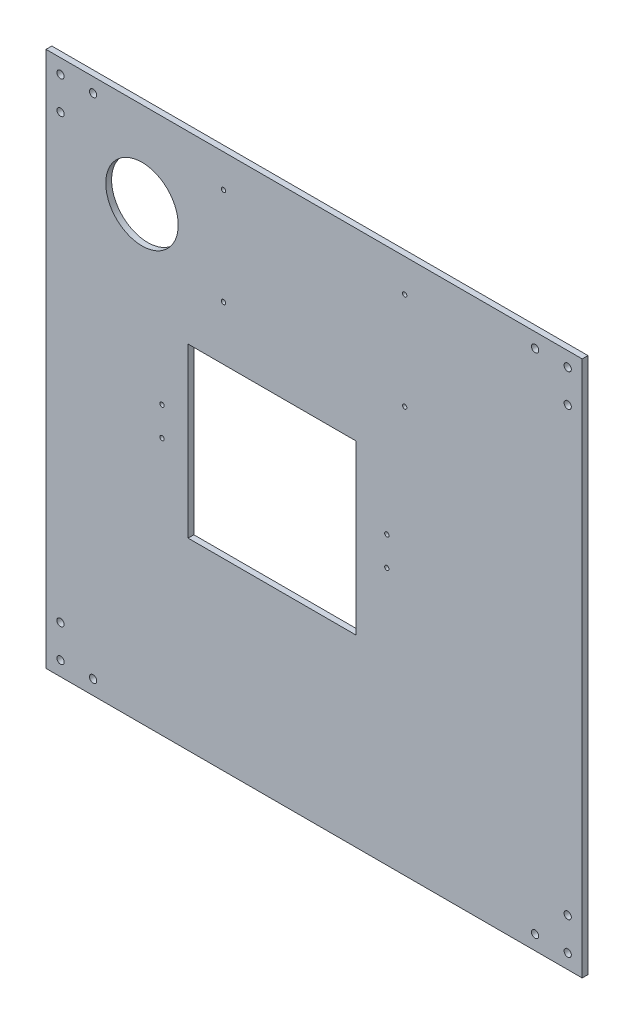
ISO-10303-21;
HEADER;
FILE_DESCRIPTION(('STEP AP214'),'2;1');
FILE_NAME('part.step','',(''),(''),'','','');
FILE_SCHEMA(('AUTOMOTIVE_DESIGN { 1 0 10303 214 1 1 1 1 }'));
ENDSEC;
DATA;
#1=APPLICATION_CONTEXT('core data for automotive mechanical design processes');
#2=APPLICATION_PROTOCOL_DEFINITION('international standard','automotive_design',2000,#1);
#3=PRODUCT_CONTEXT('',#1,'mechanical');
#4=PRODUCT('Part','Part','',(#3));
#5=PRODUCT_RELATED_PRODUCT_CATEGORY('part','',(#4));
#6=PRODUCT_DEFINITION_FORMATION('','',#4);
#7=PRODUCT_DEFINITION_CONTEXT('part definition',#1,'design');
#8=PRODUCT_DEFINITION('design','',#6,#7);
#9=PRODUCT_DEFINITION_SHAPE('','',#8);
#10=(LENGTH_UNIT() NAMED_UNIT(*) SI_UNIT(.MILLI.,.METRE.));
#11=(NAMED_UNIT(*) PLANE_ANGLE_UNIT() SI_UNIT($,.RADIAN.));
#12=(NAMED_UNIT(*) SI_UNIT($,.STERADIAN.) SOLID_ANGLE_UNIT());
#13=UNCERTAINTY_MEASURE_WITH_UNIT(LENGTH_MEASURE(1.E-05),#10,'distance_accuracy_value','');
#14=(GEOMETRIC_REPRESENTATION_CONTEXT(3) GLOBAL_UNCERTAINTY_ASSIGNED_CONTEXT((#13)) GLOBAL_UNIT_ASSIGNED_CONTEXT((#10,
#11,#12)) REPRESENTATION_CONTEXT('',''));
#15=CARTESIAN_POINT('',(0.,0.,0.));
#16=DIRECTION('',(0.,0.,1.));
#17=DIRECTION('',(1.,0.,0.));
#18=AXIS2_PLACEMENT_3D('',#15,#16,#17);
#19=CARTESIAN_POINT('',(-185.,-185.,4.));
#20=DIRECTION('',(1.,0.,0.));
#21=DIRECTION('',(0.,0.,-1.));
#22=AXIS2_PLACEMENT_3D('',#19,#20,#21);
#23=PLANE('',#22);
#24=DIRECTION('',(0.,-1.,0.));
#25=VECTOR('',#24,1.);
#26=CARTESIAN_POINT('',(-185.,-185.,0.));
#27=LINE('',#26,#25);
#28=CARTESIAN_POINT('',(-185.,185.,0.));
#29=VERTEX_POINT('',#28);
#30=CARTESIAN_POINT('',(-185.,-185.,0.));
#31=VERTEX_POINT('',#30);
#32=EDGE_CURVE('E252',#29,#31,#27,.T.);
#33=ORIENTED_EDGE('',*,*,#32,.T.);
#34=DIRECTION('',(0.,0.,-1.));
#35=VECTOR('',#34,1.);
#36=CARTESIAN_POINT('',(-185.,-185.,4.));
#37=LINE('',#36,#35);
#38=CARTESIAN_POINT('',(-185.,-185.,4.));
#39=VERTEX_POINT('',#38);
#40=EDGE_CURVE('E11',#39,#31,#37,.T.);
#41=ORIENTED_EDGE('',*,*,#40,.F.);
#42=DIRECTION('',(0.,-1.,0.));
#43=VECTOR('',#42,1.);
#44=CARTESIAN_POINT('',(-185.,-185.,4.));
#45=LINE('',#44,#43);
#46=CARTESIAN_POINT('',(-185.,185.,4.));
#47=VERTEX_POINT('',#46);
#48=EDGE_CURVE('E256',#47,#39,#45,.T.);
#49=ORIENTED_EDGE('',*,*,#48,.F.);
#50=DIRECTION('',(0.,0.,-1.));
#51=VECTOR('',#50,1.);
#52=CARTESIAN_POINT('',(-185.,185.,4.));
#53=LINE('',#52,#51);
#54=EDGE_CURVE('E270',#47,#29,#53,.T.);
#55=ORIENTED_EDGE('',*,*,#54,.T.);
#56=EDGE_LOOP('',(#33,#41,#49,#55));
#57=FACE_BOUND('',#56,.T.);
#58=ADVANCED_FACE('F42',(#57),#23,.F.);
#59=CARTESIAN_POINT('',(185.,-185.,4.));
#60=DIRECTION('',(0.,1.,0.));
#61=DIRECTION('',(-1.,0.,0.));
#62=AXIS2_PLACEMENT_3D('',#59,#60,#61);
#63=PLANE('',#62);
#64=DIRECTION('',(1.,0.,0.));
#65=VECTOR('',#64,1.);
#66=CARTESIAN_POINT('',(185.,-185.,0.));
#67=LINE('',#66,#65);
#68=CARTESIAN_POINT('',(185.,-185.,0.));
#69=VERTEX_POINT('',#68);
#70=EDGE_CURVE('E274',#31,#69,#67,.T.);
#71=ORIENTED_EDGE('',*,*,#70,.T.);
#72=DIRECTION('',(0.,0.,-1.));
#73=VECTOR('',#72,1.);
#74=CARTESIAN_POINT('',(185.,-185.,4.));
#75=LINE('',#74,#73);
#76=CARTESIAN_POINT('',(185.,-185.,4.));
#77=VERTEX_POINT('',#76);
#78=EDGE_CURVE('E50',#77,#69,#75,.T.);
#79=ORIENTED_EDGE('',*,*,#78,.F.);
#80=DIRECTION('',(1.,0.,0.));
#81=VECTOR('',#80,1.);
#82=CARTESIAN_POINT('',(185.,-185.,4.));
#83=LINE('',#82,#81);
#84=EDGE_CURVE('E260',#39,#77,#83,.T.);
#85=ORIENTED_EDGE('',*,*,#84,.F.);
#86=ORIENTED_EDGE('',*,*,#40,.T.);
#87=EDGE_LOOP('',(#71,#79,#85,#86));
#88=FACE_BOUND('',#87,.T.);
#89=ADVANCED_FACE('F309',(#88),#63,.F.);
#90=CARTESIAN_POINT('',(185.,-185.,4.));
#91=DIRECTION('',(-1.,0.,0.));
#92=DIRECTION('',(0.,0.,1.));
#93=AXIS2_PLACEMENT_3D('',#90,#91,#92);
#94=PLANE('',#93);
#95=DIRECTION('',(0.,1.,0.));
#96=VECTOR('',#95,1.);
#97=CARTESIAN_POINT('',(185.,-185.,0.));
#98=LINE('',#97,#96);
#99=CARTESIAN_POINT('',(185.,185.,0.));
#100=VERTEX_POINT('',#99);
#101=EDGE_CURVE('E277',#69,#100,#98,.T.);
#102=ORIENTED_EDGE('',*,*,#101,.T.);
#103=DIRECTION('',(0.,0.,-1.));
#104=VECTOR('',#103,1.);
#105=CARTESIAN_POINT('',(185.,185.,4.));
#106=LINE('',#105,#104);
#107=CARTESIAN_POINT('',(185.,185.,4.));
#108=VERTEX_POINT('',#107);
#109=EDGE_CURVE('E285',#108,#100,#106,.T.);
#110=ORIENTED_EDGE('',*,*,#109,.F.);
#111=DIRECTION('',(0.,1.,0.));
#112=VECTOR('',#111,1.);
#113=CARTESIAN_POINT('',(185.,-185.,4.));
#114=LINE('',#113,#112);
#115=EDGE_CURVE('E264',#77,#108,#114,.T.);
#116=ORIENTED_EDGE('',*,*,#115,.F.);
#117=ORIENTED_EDGE('',*,*,#78,.T.);
#118=EDGE_LOOP('',(#102,#110,#116,#117));
#119=FACE_BOUND('',#118,.T.);
#120=ADVANCED_FACE('F294',(#119),#94,.F.);
#121=CARTESIAN_POINT('',(185.,185.,4.));
#122=DIRECTION('',(0.,-1.,0.));
#123=DIRECTION('',(1.,0.,0.));
#124=AXIS2_PLACEMENT_3D('',#121,#122,#123);
#125=PLANE('',#124);
#126=DIRECTION('',(-1.,0.,0.));
#127=VECTOR('',#126,1.);
#128=CARTESIAN_POINT('',(185.,185.,0.));
#129=LINE('',#128,#127);
#130=EDGE_CURVE('E261',#100,#29,#129,.T.);
#131=ORIENTED_EDGE('',*,*,#130,.T.);
#132=ORIENTED_EDGE('',*,*,#54,.F.);
#133=DIRECTION('',(-1.,0.,0.));
#134=VECTOR('',#133,1.);
#135=CARTESIAN_POINT('',(185.,185.,4.));
#136=LINE('',#135,#134);
#137=EDGE_CURVE('E267',#108,#47,#136,.T.);
#138=ORIENTED_EDGE('',*,*,#137,.F.);
#139=ORIENTED_EDGE('',*,*,#109,.T.);
#140=EDGE_LOOP('',(#131,#132,#138,#139));
#141=FACE_BOUND('',#140,.T.);
#142=ADVANCED_FACE('F303',(#141),#125,.F.);
#143=CARTESIAN_POINT('',(0.,0.,4.));
#144=DIRECTION('',(0.,0.,1.));
#145=DIRECTION('',(1.,0.,0.));
#146=AXIS2_PLACEMENT_3D('',#143,#144,#145);
#147=PLANE('',#146);
#148=CARTESIAN_POINT('',(50.2133571496809,12.6940309715149,4.));
#149=DIRECTION('',(0.,0.,1.));
#150=DIRECTION('',(1.,0.,0.));
#151=AXIS2_PLACEMENT_3D('',#148,#149,#150);
#152=CIRCLE('',#151,1.5);
#153=CARTESIAN_POINT('',(51.7133571496809,12.6940309715149,4.));
#154=VERTEX_POINT('',#153);
#155=EDGE_CURVE('E454',#154,#154,#152,.T.);
#156=ORIENTED_EDGE('',*,*,#155,.F.);
#157=EDGE_LOOP('',(#156));
#158=FACE_BOUND('',#157,.T.);
#159=CARTESIAN_POINT('',(-104.956152895011,-7.30871880372212,4.));
#160=DIRECTION('',(0.,0.,1.));
#161=DIRECTION('',(1.,0.,0.));
#162=AXIS2_PLACEMENT_3D('',#159,#160,#161);
#163=CIRCLE('',#162,1.5);
#164=CARTESIAN_POINT('',(-103.456152895011,-7.30871880372212,4.));
#165=VERTEX_POINT('',#164);
#166=EDGE_CURVE('E450',#165,#165,#163,.T.);
#167=ORIENTED_EDGE('',*,*,#166,.F.);
#168=EDGE_LOOP('',(#167));
#169=FACE_BOUND('',#168,.T.);
#170=CARTESIAN_POINT('',(-104.956152895011,12.6912811962779,4.));
#171=DIRECTION('',(0.,0.,1.));
#172=DIRECTION('',(1.,0.,0.));
#173=AXIS2_PLACEMENT_3D('',#170,#171,#172);
#174=CIRCLE('',#173,1.50000000000001);
#175=CARTESIAN_POINT('',(-103.456152895011,12.6912811962779,4.));
#176=VERTEX_POINT('',#175);
#177=EDGE_CURVE('E424',#176,#176,#174,.T.);
#178=ORIENTED_EDGE('',*,*,#177,.F.);
#179=EDGE_LOOP('',(#178));
#180=FACE_BOUND('',#179,.T.);
#181=CARTESIAN_POINT('',(50.2133571496808,-7.30596902848515,4.));
#182=DIRECTION('',(0.,0.,1.));
#183=DIRECTION('',(1.,0.,0.));
#184=AXIS2_PLACEMENT_3D('',#181,#182,#183);
#185=CIRCLE('',#184,1.5);
#186=CARTESIAN_POINT('',(51.7133571496808,-7.30596902848515,4.));
#187=VERTEX_POINT('',#186);
#188=EDGE_CURVE('E444',#187,#187,#185,.T.);
#189=ORIENTED_EDGE('',*,*,#188,.F.);
#190=EDGE_LOOP('',(#189));
#191=FACE_BOUND('',#190,.T.);
#192=CARTESIAN_POINT('',(-118.76985494899,125.631801741306,4.));
#193=DIRECTION('',(0.,0.,-1.));
#194=DIRECTION('',(-1.,0.,0.));
#195=AXIS2_PLACEMENT_3D('',#192,#193,#194);
#196=CIRCLE('',#195,25.);
#197=CARTESIAN_POINT('',(-143.76985494899,125.631801741306,4.));
#198=VERTEX_POINT('',#197);
#199=EDGE_CURVE('E459',#198,#198,#196,.T.);
#200=ORIENTED_EDGE('',*,*,#199,.T.);
#201=EDGE_LOOP('',(#200));
#202=FACE_BOUND('',#201,.T.);
#203=CARTESIAN_POINT('',(-62.5,95.2497952517391,4.));
#204=DIRECTION('',(0.,0.,-1.));
#205=DIRECTION('',(-1.,0.,0.));
#206=AXIS2_PLACEMENT_3D('',#203,#204,#205);
#207=CIRCLE('',#206,1.5);
#208=CARTESIAN_POINT('',(-64.,95.2497952517391,4.));
#209=VERTEX_POINT('',#208);
#210=EDGE_CURVE('E479',#209,#209,#207,.T.);
#211=ORIENTED_EDGE('',*,*,#210,.T.);
#212=EDGE_LOOP('',(#211));
#213=FACE_BOUND('',#212,.T.);
#214=CARTESIAN_POINT('',(62.5,162.249795251739,4.));
#215=DIRECTION('',(0.,0.,-1.));
#216=DIRECTION('',(-1.,0.,0.));
#217=AXIS2_PLACEMENT_3D('',#214,#215,#216);
#218=CIRCLE('',#217,1.5);
#219=CARTESIAN_POINT('',(61.,162.249795251739,4.));
#220=VERTEX_POINT('',#219);
#221=EDGE_CURVE('E471',#220,#220,#218,.T.);
#222=ORIENTED_EDGE('',*,*,#221,.T.);
#223=EDGE_LOOP('',(#222));
#224=FACE_BOUND('',#223,.T.);
#225=CARTESIAN_POINT('',(-62.5,162.249795251739,4.));
#226=DIRECTION('',(0.,0.,-1.));
#227=DIRECTION('',(-1.,0.,0.));
#228=AXIS2_PLACEMENT_3D('',#225,#226,#227);
#229=CIRCLE('',#228,1.5);
#230=CARTESIAN_POINT('',(-64.,162.249795251739,4.));
#231=VERTEX_POINT('',#230);
#232=EDGE_CURVE('E463',#231,#231,#229,.T.);
#233=ORIENTED_EDGE('',*,*,#232,.T.);
#234=EDGE_LOOP('',(#233));
#235=FACE_BOUND('',#234,.T.);
#236=CARTESIAN_POINT('',(62.5,95.2497952517391,4.));
#237=DIRECTION('',(0.,0.,-1.));
#238=DIRECTION('',(-1.,0.,0.));
#239=AXIS2_PLACEMENT_3D('',#236,#237,#238);
#240=CIRCLE('',#239,1.5);
#241=CARTESIAN_POINT('',(61.,95.2497952517391,4.));
#242=VERTEX_POINT('',#241);
#243=EDGE_CURVE('E145',#242,#242,#240,.T.);
#244=ORIENTED_EDGE('',*,*,#243,.T.);
#245=EDGE_LOOP('',(#244));
#246=FACE_BOUND('',#245,.T.);
#247=DIRECTION('',(0.,-1.,0.));
#248=VECTOR('',#247,1.);
#249=CARTESIAN_POINT('',(29.0438471049889,57.9100000000002,4.));
#250=LINE('',#249,#248);
#251=CARTESIAN_POINT('',(29.0438471049889,57.9100000000002,4.));
#252=VERTEX_POINT('',#251);
#253=CARTESIAN_POINT('',(29.0438471049887,-58.0899999999998,4.));
#254=VERTEX_POINT('',#253);
#255=EDGE_CURVE('E109',#252,#254,#250,.T.);
#256=ORIENTED_EDGE('',*,*,#255,.T.);
#257=DIRECTION('',(-1.,0.,0.));
#258=VECTOR('',#257,1.);
#259=CARTESIAN_POINT('',(29.0438471049887,-58.0899999999998,4.));
#260=LINE('',#259,#258);
#261=CARTESIAN_POINT('',(-86.9561528950114,-58.0899999999996,4.));
#262=VERTEX_POINT('',#261);
#263=EDGE_CURVE('E119',#254,#262,#260,.T.);
#264=ORIENTED_EDGE('',*,*,#263,.T.);
#265=DIRECTION('',(0.,1.,0.));
#266=VECTOR('',#265,1.);
#267=CARTESIAN_POINT('',(-86.9561528950114,-58.0899999999996,4.));
#268=LINE('',#267,#266);
#269=CARTESIAN_POINT('',(-86.9561528950111,57.9100000000004,4.));
#270=VERTEX_POINT('',#269);
#271=EDGE_CURVE('E57',#262,#270,#268,.T.);
#272=ORIENTED_EDGE('',*,*,#271,.T.);
#273=DIRECTION('',(1.,0.,0.));
#274=VECTOR('',#273,1.);
#275=CARTESIAN_POINT('',(-86.9561528950111,57.9100000000004,4.));
#276=LINE('',#275,#274);
#277=EDGE_CURVE('E116',#270,#252,#276,.T.);
#278=ORIENTED_EDGE('',*,*,#277,.T.);
#279=EDGE_LOOP('',(#256,#264,#272,#278));
#280=FACE_BOUND('',#279,.T.);
#281=CARTESIAN_POINT('',(-152.499999999999,175.000000000001,4.));
#282=DIRECTION('',(0.,0.,1.));
#283=DIRECTION('',(1.,0.,0.));
#284=AXIS2_PLACEMENT_3D('',#281,#282,#283);
#285=CIRCLE('',#284,2.5);
#286=CARTESIAN_POINT('',(-149.999999999999,175.000000000001,4.));
#287=VERTEX_POINT('',#286);
#288=EDGE_CURVE('E200',#287,#287,#285,.T.);
#289=ORIENTED_EDGE('',*,*,#288,.F.);
#290=EDGE_LOOP('',(#289));
#291=FACE_BOUND('',#290,.T.);
#292=CARTESIAN_POINT('',(175.000000000001,174.999999999999,4.));
#293=DIRECTION('',(0.,0.,1.));
#294=DIRECTION('',(1.,0.,0.));
#295=AXIS2_PLACEMENT_3D('',#292,#293,#294);
#296=CIRCLE('',#295,2.49999999999999);
#297=CARTESIAN_POINT('',(177.500000000001,174.999999999999,4.));
#298=VERTEX_POINT('',#297);
#299=EDGE_CURVE('E209',#298,#298,#296,.T.);
#300=ORIENTED_EDGE('',*,*,#299,.F.);
#301=EDGE_LOOP('',(#300));
#302=FACE_BOUND('',#301,.T.);
#303=CARTESIAN_POINT('',(152.500000000001,174.999999999999,4.));
#304=DIRECTION('',(0.,0.,1.));
#305=DIRECTION('',(1.,0.,0.));
#306=AXIS2_PLACEMENT_3D('',#303,#304,#305);
#307=CIRCLE('',#306,2.5);
#308=CARTESIAN_POINT('',(155.000000000001,174.999999999999,4.));
#309=VERTEX_POINT('',#308);
#310=EDGE_CURVE('E184',#309,#309,#307,.T.);
#311=ORIENTED_EDGE('',*,*,#310,.F.);
#312=EDGE_LOOP('',(#311));
#313=FACE_BOUND('',#312,.T.);
#314=CARTESIAN_POINT('',(175.000000000001,152.499999999999,4.));
#315=DIRECTION('',(0.,0.,1.));
#316=DIRECTION('',(1.,0.,0.));
#317=AXIS2_PLACEMENT_3D('',#314,#315,#316);
#318=CIRCLE('',#317,2.49999999999999);
#319=CARTESIAN_POINT('',(177.500000000001,152.499999999999,4.));
#320=VERTEX_POINT('',#319);
#321=EDGE_CURVE('E193',#320,#320,#318,.T.);
#322=ORIENTED_EDGE('',*,*,#321,.F.);
#323=EDGE_LOOP('',(#322));
#324=FACE_BOUND('',#323,.T.);
#325=CARTESIAN_POINT('',(-174.999999999999,152.500000000001,4.));
#326=DIRECTION('',(0.,0.,1.));
#327=DIRECTION('',(1.,0.,0.));
#328=AXIS2_PLACEMENT_3D('',#325,#326,#327);
#329=CIRCLE('',#328,2.5);
#330=CARTESIAN_POINT('',(-172.499999999999,152.500000000001,4.));
#331=VERTEX_POINT('',#330);
#332=EDGE_CURVE('E241',#331,#331,#329,.T.);
#333=ORIENTED_EDGE('',*,*,#332,.F.);
#334=EDGE_LOOP('',(#333));
#335=FACE_BOUND('',#334,.T.);
#336=CARTESIAN_POINT('',(-174.999999999999,175.000000000001,4.));
#337=DIRECTION('',(0.,0.,1.));
#338=DIRECTION('',(1.,0.,0.));
#339=AXIS2_PLACEMENT_3D('',#336,#337,#338);
#340=CIRCLE('',#339,2.5);
#341=CARTESIAN_POINT('',(-172.499999999999,175.000000000001,4.));
#342=VERTEX_POINT('',#341);
#343=EDGE_CURVE('E233',#342,#342,#340,.T.);
#344=ORIENTED_EDGE('',*,*,#343,.F.);
#345=EDGE_LOOP('',(#344));
#346=FACE_BOUND('',#345,.T.);
#347=CARTESIAN_POINT('',(-175.,-152.5,4.));
#348=DIRECTION('',(0.,0.,1.));
#349=DIRECTION('',(1.,0.,0.));
#350=AXIS2_PLACEMENT_3D('',#347,#348,#349);
#351=CIRCLE('',#350,2.5);
#352=CARTESIAN_POINT('',(-172.5,-152.5,4.));
#353=VERTEX_POINT('',#352);
#354=EDGE_CURVE('E225',#353,#353,#351,.T.);
#355=ORIENTED_EDGE('',*,*,#354,.F.);
#356=EDGE_LOOP('',(#355));
#357=FACE_BOUND('',#356,.T.);
#358=CARTESIAN_POINT('',(-152.5,-175.,4.));
#359=DIRECTION('',(0.,0.,1.));
#360=DIRECTION('',(1.,0.,0.));
#361=AXIS2_PLACEMENT_3D('',#358,#359,#360);
#362=CIRCLE('',#361,2.5);
#363=CARTESIAN_POINT('',(-150.,-175.,4.));
#364=VERTEX_POINT('',#363);
#365=EDGE_CURVE('E216',#364,#364,#362,.T.);
#366=ORIENTED_EDGE('',*,*,#365,.F.);
#367=EDGE_LOOP('',(#366));
#368=FACE_BOUND('',#367,.T.);
#369=CARTESIAN_POINT('',(174.999999999998,-175.000000000002,4.));
#370=DIRECTION('',(0.,0.,1.));
#371=DIRECTION('',(1.,0.,0.));
#372=AXIS2_PLACEMENT_3D('',#369,#370,#371);
#373=CIRCLE('',#372,2.49999999999999);
#374=CARTESIAN_POINT('',(177.499999999998,-175.000000000002,4.));
#375=VERTEX_POINT('',#374);
#376=EDGE_CURVE('E160',#375,#375,#373,.T.);
#377=ORIENTED_EDGE('',*,*,#376,.F.);
#378=EDGE_LOOP('',(#377));
#379=FACE_BOUND('',#378,.T.);
#380=CARTESIAN_POINT('',(174.999999999998,-152.500000000002,4.));
#381=DIRECTION('',(0.,0.,1.));
#382=DIRECTION('',(1.,0.,0.));
#383=AXIS2_PLACEMENT_3D('',#380,#381,#382);
#384=CIRCLE('',#383,2.49999999999999);
#385=CARTESIAN_POINT('',(177.499999999998,-152.500000000002,4.));
#386=VERTEX_POINT('',#385);
#387=EDGE_CURVE('E169',#386,#386,#384,.T.);
#388=ORIENTED_EDGE('',*,*,#387,.F.);
#389=EDGE_LOOP('',(#388));
#390=FACE_BOUND('',#389,.T.);
#391=CARTESIAN_POINT('',(152.499999999998,-175.000000000002,4.));
#392=DIRECTION('',(0.,0.,1.));
#393=DIRECTION('',(1.,0.,0.));
#394=AXIS2_PLACEMENT_3D('',#391,#392,#393);
#395=CIRCLE('',#394,2.50000000000001);
#396=CARTESIAN_POINT('',(154.999999999998,-175.000000000002,4.));
#397=VERTEX_POINT('',#396);
#398=EDGE_CURVE('E177',#397,#397,#395,.T.);
#399=ORIENTED_EDGE('',*,*,#398,.F.);
#400=EDGE_LOOP('',(#399));
#401=FACE_BOUND('',#400,.T.);
#402=CARTESIAN_POINT('',(-175.,-175.,4.));
#403=DIRECTION('',(0.,0.,1.));
#404=DIRECTION('',(1.,0.,0.));
#405=AXIS2_PLACEMENT_3D('',#402,#403,#404);
#406=CIRCLE('',#405,2.5);
#407=CARTESIAN_POINT('',(-172.5,-175.,4.));
#408=VERTEX_POINT('',#407);
#409=EDGE_CURVE('E220',#408,#408,#406,.T.);
#410=ORIENTED_EDGE('',*,*,#409,.F.);
#411=EDGE_LOOP('',(#410));
#412=FACE_BOUND('',#411,.T.);
#413=ORIENTED_EDGE('',*,*,#48,.T.);
#414=ORIENTED_EDGE('',*,*,#84,.T.);
#415=ORIENTED_EDGE('',*,*,#115,.T.);
#416=ORIENTED_EDGE('',*,*,#137,.T.);
#417=EDGE_LOOP('',(#413,#414,#415,#416));
#418=FACE_BOUND('',#417,.T.);
#419=ADVANCED_FACE('F124',(#158,#169,#180,#191,#202,#213,#224,#235,#246,#280,#291,#302,#313,
#324,#335,#346,#357,#368,#379,#390,#401,#412,#418),#147,.T.);
#420=CARTESIAN_POINT('',(0.,0.,0.));
#421=DIRECTION('',(0.,0.,1.));
#422=DIRECTION('',(1.,0.,0.));
#423=AXIS2_PLACEMENT_3D('',#420,#421,#422);
#424=PLANE('',#423);
#425=CARTESIAN_POINT('',(50.2133571496809,12.6940309715149,0.));
#426=DIRECTION('',(0.,0.,-1.));
#427=DIRECTION('',(-1.,0.,0.));
#428=AXIS2_PLACEMENT_3D('',#425,#426,#427);
#429=CIRCLE('',#428,1.5);
#430=CARTESIAN_POINT('',(48.7133571496809,12.6940309715149,0.));
#431=VERTEX_POINT('',#430);
#432=EDGE_CURVE('E434',#431,#431,#429,.T.);
#433=ORIENTED_EDGE('',*,*,#432,.F.);
#434=EDGE_LOOP('',(#433));
#435=FACE_BOUND('',#434,.T.);
#436=CARTESIAN_POINT('',(-104.956152895011,-7.30871880372212,0.));
#437=DIRECTION('',(0.,0.,-1.));
#438=DIRECTION('',(-1.,0.,0.));
#439=AXIS2_PLACEMENT_3D('',#436,#437,#438);
#440=CIRCLE('',#439,1.5);
#441=CARTESIAN_POINT('',(-106.456152895011,-7.30871880372212,0.));
#442=VERTEX_POINT('',#441);
#443=EDGE_CURVE('E430',#442,#442,#440,.T.);
#444=ORIENTED_EDGE('',*,*,#443,.F.);
#445=EDGE_LOOP('',(#444));
#446=FACE_BOUND('',#445,.T.);
#447=CARTESIAN_POINT('',(-104.956152895011,12.6912811962779,0.));
#448=DIRECTION('',(0.,0.,-1.));
#449=DIRECTION('',(-1.,0.,0.));
#450=AXIS2_PLACEMENT_3D('',#447,#448,#449);
#451=CIRCLE('',#450,1.50000000000001);
#452=CARTESIAN_POINT('',(-106.456152895011,12.6912811962779,0.));
#453=VERTEX_POINT('',#452);
#454=EDGE_CURVE('E427',#453,#453,#451,.T.);
#455=ORIENTED_EDGE('',*,*,#454,.F.);
#456=EDGE_LOOP('',(#455));
#457=FACE_BOUND('',#456,.T.);
#458=CARTESIAN_POINT('',(50.2133571496808,-7.30596902848515,0.));
#459=DIRECTION('',(0.,0.,-1.));
#460=DIRECTION('',(-1.,0.,0.));
#461=AXIS2_PLACEMENT_3D('',#458,#459,#460);
#462=CIRCLE('',#461,1.5);
#463=CARTESIAN_POINT('',(48.7133571496808,-7.30596902848515,0.));
#464=VERTEX_POINT('',#463);
#465=EDGE_CURVE('E439',#464,#464,#462,.T.);
#466=ORIENTED_EDGE('',*,*,#465,.F.);
#467=EDGE_LOOP('',(#466));
#468=FACE_BOUND('',#467,.T.);
#469=CARTESIAN_POINT('',(-118.76985494899,125.631801741306,0.));
#470=DIRECTION('',(0.,0.,-1.));
#471=DIRECTION('',(-1.,0.,0.));
#472=AXIS2_PLACEMENT_3D('',#469,#470,#471);
#473=CIRCLE('',#472,25.);
#474=CARTESIAN_POINT('',(-143.76985494899,125.631801741306,0.));
#475=VERTEX_POINT('',#474);
#476=EDGE_CURVE('E458',#475,#475,#473,.T.);
#477=ORIENTED_EDGE('',*,*,#476,.F.);
#478=EDGE_LOOP('',(#477));
#479=FACE_BOUND('',#478,.T.);
#480=CARTESIAN_POINT('',(-62.5,95.2497952517391,0.));
#481=DIRECTION('',(0.,0.,-1.));
#482=DIRECTION('',(-1.,0.,0.));
#483=AXIS2_PLACEMENT_3D('',#480,#481,#482);
#484=CIRCLE('',#483,1.5);
#485=CARTESIAN_POINT('',(-64.,95.2497952517391,0.));
#486=VERTEX_POINT('',#485);
#487=EDGE_CURVE('E475',#486,#486,#484,.T.);
#488=ORIENTED_EDGE('',*,*,#487,.F.);
#489=EDGE_LOOP('',(#488));
#490=FACE_BOUND('',#489,.T.);
#491=CARTESIAN_POINT('',(62.5,162.249795251739,0.));
#492=DIRECTION('',(0.,0.,-1.));
#493=DIRECTION('',(-1.,0.,0.));
#494=AXIS2_PLACEMENT_3D('',#491,#492,#493);
#495=CIRCLE('',#494,1.5);
#496=CARTESIAN_POINT('',(61.,162.249795251739,0.));
#497=VERTEX_POINT('',#496);
#498=EDGE_CURVE('E483',#497,#497,#495,.T.);
#499=ORIENTED_EDGE('',*,*,#498,.F.);
#500=EDGE_LOOP('',(#499));
#501=FACE_BOUND('',#500,.T.);
#502=CARTESIAN_POINT('',(-62.5,162.249795251739,0.));
#503=DIRECTION('',(0.,0.,-1.));
#504=DIRECTION('',(-1.,0.,0.));
#505=AXIS2_PLACEMENT_3D('',#502,#503,#504);
#506=CIRCLE('',#505,1.5);
#507=CARTESIAN_POINT('',(-64.,162.249795251739,0.));
#508=VERTEX_POINT('',#507);
#509=EDGE_CURVE('E467',#508,#508,#506,.T.);
#510=ORIENTED_EDGE('',*,*,#509,.F.);
#511=EDGE_LOOP('',(#510));
#512=FACE_BOUND('',#511,.T.);
#513=CARTESIAN_POINT('',(62.5,95.2497952517391,0.));
#514=DIRECTION('',(0.,0.,-1.));
#515=DIRECTION('',(-1.,0.,0.));
#516=AXIS2_PLACEMENT_3D('',#513,#514,#515);
#517=CIRCLE('',#516,1.5);
#518=CARTESIAN_POINT('',(61.,95.2497952517391,0.));
#519=VERTEX_POINT('',#518);
#520=EDGE_CURVE('E135',#519,#519,#517,.T.);
#521=ORIENTED_EDGE('',*,*,#520,.F.);
#522=EDGE_LOOP('',(#521));
#523=FACE_BOUND('',#522,.T.);
#524=DIRECTION('',(-1.,0.,0.));
#525=VECTOR('',#524,1.);
#526=CARTESIAN_POINT('',(29.0438471049887,-58.0899999999998,0.));
#527=LINE('',#526,#525);
#528=CARTESIAN_POINT('',(29.0438471049887,-58.0899999999998,0.));
#529=VERTEX_POINT('',#528);
#530=CARTESIAN_POINT('',(-86.9561528950114,-58.0899999999996,0.));
#531=VERTEX_POINT('',#530);
#532=EDGE_CURVE('E144',#529,#531,#527,.T.);
#533=ORIENTED_EDGE('',*,*,#532,.F.);
#534=DIRECTION('',(0.,-1.,0.));
#535=VECTOR('',#534,1.);
#536=CARTESIAN_POINT('',(29.0438471049889,57.9100000000002,0.));
#537=LINE('',#536,#535);
#538=CARTESIAN_POINT('',(29.0438471049889,57.9100000000002,0.));
#539=VERTEX_POINT('',#538);
#540=EDGE_CURVE('E65',#539,#529,#537,.T.);
#541=ORIENTED_EDGE('',*,*,#540,.F.);
#542=DIRECTION('',(1.,0.,0.));
#543=VECTOR('',#542,1.);
#544=CARTESIAN_POINT('',(-86.9561528950111,57.9100000000004,0.));
#545=LINE('',#544,#543);
#546=CARTESIAN_POINT('',(-86.9561528950111,57.9100000000004,0.));
#547=VERTEX_POINT('',#546);
#548=EDGE_CURVE('E128',#547,#539,#545,.T.);
#549=ORIENTED_EDGE('',*,*,#548,.F.);
#550=DIRECTION('',(0.,1.,0.));
#551=VECTOR('',#550,1.);
#552=CARTESIAN_POINT('',(-86.9561528950114,-58.0899999999996,0.));
#553=LINE('',#552,#551);
#554=EDGE_CURVE('E132',#531,#547,#553,.T.);
#555=ORIENTED_EDGE('',*,*,#554,.F.);
#556=EDGE_LOOP('',(#533,#541,#549,#555));
#557=FACE_BOUND('',#556,.T.);
#558=CARTESIAN_POINT('',(-152.499999999999,175.000000000001,0.));
#559=DIRECTION('',(0.,0.,1.));
#560=DIRECTION('',(1.,0.,0.));
#561=AXIS2_PLACEMENT_3D('',#558,#559,#560);
#562=CIRCLE('',#561,2.5);
#563=CARTESIAN_POINT('',(-149.999999999999,175.000000000001,0.));
#564=VERTEX_POINT('',#563);
#565=EDGE_CURVE('E205',#564,#564,#562,.T.);
#566=ORIENTED_EDGE('',*,*,#565,.T.);
#567=EDGE_LOOP('',(#566));
#568=FACE_BOUND('',#567,.T.);
#569=CARTESIAN_POINT('',(175.000000000001,174.999999999999,0.));
#570=DIRECTION('',(0.,0.,1.));
#571=DIRECTION('',(1.,0.,0.));
#572=AXIS2_PLACEMENT_3D('',#569,#570,#571);
#573=CIRCLE('',#572,2.49999999999999);
#574=CARTESIAN_POINT('',(177.500000000001,174.999999999999,0.));
#575=VERTEX_POINT('',#574);
#576=EDGE_CURVE('E188',#575,#575,#573,.T.);
#577=ORIENTED_EDGE('',*,*,#576,.T.);
#578=EDGE_LOOP('',(#577));
#579=FACE_BOUND('',#578,.T.);
#580=CARTESIAN_POINT('',(152.500000000001,174.999999999999,0.));
#581=DIRECTION('',(0.,0.,1.));
#582=DIRECTION('',(1.,0.,0.));
#583=AXIS2_PLACEMENT_3D('',#580,#581,#582);
#584=CIRCLE('',#583,2.5);
#585=CARTESIAN_POINT('',(155.000000000001,174.999999999999,0.));
#586=VERTEX_POINT('',#585);
#587=EDGE_CURVE('E189',#586,#586,#584,.T.);
#588=ORIENTED_EDGE('',*,*,#587,.T.);
#589=EDGE_LOOP('',(#588));
#590=FACE_BOUND('',#589,.T.);
#591=CARTESIAN_POINT('',(175.000000000001,152.499999999999,0.));
#592=DIRECTION('',(0.,0.,1.));
#593=DIRECTION('',(1.,0.,0.));
#594=AXIS2_PLACEMENT_3D('',#591,#592,#593);
#595=CIRCLE('',#594,2.49999999999999);
#596=CARTESIAN_POINT('',(177.500000000001,152.499999999999,0.));
#597=VERTEX_POINT('',#596);
#598=EDGE_CURVE('E164',#597,#597,#595,.T.);
#599=ORIENTED_EDGE('',*,*,#598,.T.);
#600=EDGE_LOOP('',(#599));
#601=FACE_BOUND('',#600,.T.);
#602=CARTESIAN_POINT('',(-174.999999999999,152.500000000001,0.));
#603=DIRECTION('',(0.,0.,1.));
#604=DIRECTION('',(1.,0.,0.));
#605=AXIS2_PLACEMENT_3D('',#602,#603,#604);
#606=CIRCLE('',#605,2.5);
#607=CARTESIAN_POINT('',(-172.499999999999,152.500000000001,0.));
#608=VERTEX_POINT('',#607);
#609=EDGE_CURVE('E204',#608,#608,#606,.T.);
#610=ORIENTED_EDGE('',*,*,#609,.T.);
#611=EDGE_LOOP('',(#610));
#612=FACE_BOUND('',#611,.T.);
#613=CARTESIAN_POINT('',(-174.999999999999,175.000000000001,0.));
#614=DIRECTION('',(0.,0.,1.));
#615=DIRECTION('',(1.,0.,0.));
#616=AXIS2_PLACEMENT_3D('',#613,#614,#615);
#617=CIRCLE('',#616,2.5);
#618=CARTESIAN_POINT('',(-172.499999999999,175.000000000001,0.));
#619=VERTEX_POINT('',#618);
#620=EDGE_CURVE('E237',#619,#619,#617,.T.);
#621=ORIENTED_EDGE('',*,*,#620,.T.);
#622=EDGE_LOOP('',(#621));
#623=FACE_BOUND('',#622,.T.);
#624=CARTESIAN_POINT('',(-175.,-152.5,0.));
#625=DIRECTION('',(0.,0.,1.));
#626=DIRECTION('',(1.,0.,0.));
#627=AXIS2_PLACEMENT_3D('',#624,#625,#626);
#628=CIRCLE('',#627,2.5);
#629=CARTESIAN_POINT('',(-172.5,-152.5,0.));
#630=VERTEX_POINT('',#629);
#631=EDGE_CURVE('E229',#630,#630,#628,.T.);
#632=ORIENTED_EDGE('',*,*,#631,.T.);
#633=EDGE_LOOP('',(#632));
#634=FACE_BOUND('',#633,.T.);
#635=CARTESIAN_POINT('',(-152.5,-175.,0.));
#636=DIRECTION('',(0.,0.,1.));
#637=DIRECTION('',(1.,0.,0.));
#638=AXIS2_PLACEMENT_3D('',#635,#636,#637);
#639=CIRCLE('',#638,2.5);
#640=CARTESIAN_POINT('',(-150.,-175.,0.));
#641=VERTEX_POINT('',#640);
#642=EDGE_CURVE('E221',#641,#641,#639,.T.);
#643=ORIENTED_EDGE('',*,*,#642,.T.);
#644=EDGE_LOOP('',(#643));
#645=FACE_BOUND('',#644,.T.);
#646=CARTESIAN_POINT('',(174.999999999998,-175.000000000002,0.));
#647=DIRECTION('',(0.,0.,1.));
#648=DIRECTION('',(1.,0.,0.));
#649=AXIS2_PLACEMENT_3D('',#646,#647,#648);
#650=CIRCLE('',#649,2.49999999999999);
#651=CARTESIAN_POINT('',(177.499999999998,-175.000000000002,0.));
#652=VERTEX_POINT('',#651);
#653=EDGE_CURVE('E165',#652,#652,#650,.T.);
#654=ORIENTED_EDGE('',*,*,#653,.T.);
#655=EDGE_LOOP('',(#654));
#656=FACE_BOUND('',#655,.T.);
#657=CARTESIAN_POINT('',(174.999999999998,-152.500000000002,0.));
#658=DIRECTION('',(0.,0.,1.));
#659=DIRECTION('',(1.,0.,0.));
#660=AXIS2_PLACEMENT_3D('',#657,#658,#659);
#661=CIRCLE('',#660,2.49999999999999);
#662=CARTESIAN_POINT('',(177.499999999998,-152.500000000002,0.));
#663=VERTEX_POINT('',#662);
#664=EDGE_CURVE('E173',#663,#663,#661,.T.);
#665=ORIENTED_EDGE('',*,*,#664,.T.);
#666=EDGE_LOOP('',(#665));
#667=FACE_BOUND('',#666,.T.);
#668=CARTESIAN_POINT('',(152.499999999998,-175.000000000002,0.));
#669=DIRECTION('',(0.,0.,1.));
#670=DIRECTION('',(1.,0.,0.));
#671=AXIS2_PLACEMENT_3D('',#668,#669,#670);
#672=CIRCLE('',#671,2.50000000000001);
#673=CARTESIAN_POINT('',(154.999999999998,-175.000000000002,0.));
#674=VERTEX_POINT('',#673);
#675=EDGE_CURVE('E154',#674,#674,#672,.T.);
#676=ORIENTED_EDGE('',*,*,#675,.T.);
#677=EDGE_LOOP('',(#676));
#678=FACE_BOUND('',#677,.T.);
#679=CARTESIAN_POINT('',(-175.,-175.,0.));
#680=DIRECTION('',(0.,0.,1.));
#681=DIRECTION('',(1.,0.,0.));
#682=AXIS2_PLACEMENT_3D('',#679,#680,#681);
#683=CIRCLE('',#682,2.5);
#684=CARTESIAN_POINT('',(-172.5,-175.,0.));
#685=VERTEX_POINT('',#684);
#686=EDGE_CURVE('E248',#685,#685,#683,.T.);
#687=ORIENTED_EDGE('',*,*,#686,.T.);
#688=EDGE_LOOP('',(#687));
#689=FACE_BOUND('',#688,.T.);
#690=ORIENTED_EDGE('',*,*,#32,.F.);
#691=ORIENTED_EDGE('',*,*,#130,.F.);
#692=ORIENTED_EDGE('',*,*,#101,.F.);
#693=ORIENTED_EDGE('',*,*,#70,.F.);
#694=EDGE_LOOP('',(#690,#691,#692,#693));
#695=FACE_BOUND('',#694,.T.);
#696=ADVANCED_FACE('F300',(#435,#446,#457,#468,#479,#490,#501,#512,#523,#557,#568,#579,#590,
#601,#612,#623,#634,#645,#656,#667,#678,#689,#695),#424,.F.);
#697=CARTESIAN_POINT('',(-175.,-175.,0.));
#698=DIRECTION('',(0.,0.,1.));
#699=DIRECTION('',(1.,0.,0.));
#700=AXIS2_PLACEMENT_3D('',#697,#698,#699);
#701=CYLINDRICAL_SURFACE('',#700,2.5);
#702=ORIENTED_EDGE('',*,*,#686,.F.);
#703=EDGE_LOOP('',(#702));
#704=FACE_BOUND('',#703,.T.);
#705=ORIENTED_EDGE('',*,*,#409,.T.);
#706=EDGE_LOOP('',(#705));
#707=FACE_BOUND('',#706,.T.);
#708=ADVANCED_FACE('F321',(#704,#707),#701,.F.);
#709=CARTESIAN_POINT('',(152.499999999998,-175.000000000002,0.));
#710=DIRECTION('',(0.,0.,1.));
#711=DIRECTION('',(1.,0.,0.));
#712=AXIS2_PLACEMENT_3D('',#709,#710,#711);
#713=CYLINDRICAL_SURFACE('',#712,2.50000000000001);
#714=ORIENTED_EDGE('',*,*,#675,.F.);
#715=EDGE_LOOP('',(#714));
#716=FACE_BOUND('',#715,.T.);
#717=ORIENTED_EDGE('',*,*,#398,.T.);
#718=EDGE_LOOP('',(#717));
#719=FACE_BOUND('',#718,.T.);
#720=ADVANCED_FACE('F328',(#716,#719),#713,.F.);
#721=CARTESIAN_POINT('',(174.999999999998,-152.500000000002,0.));
#722=DIRECTION('',(0.,0.,1.));
#723=DIRECTION('',(1.,0.,0.));
#724=AXIS2_PLACEMENT_3D('',#721,#722,#723);
#725=CYLINDRICAL_SURFACE('',#724,2.49999999999999);
#726=ORIENTED_EDGE('',*,*,#664,.F.);
#727=EDGE_LOOP('',(#726));
#728=FACE_BOUND('',#727,.T.);
#729=ORIENTED_EDGE('',*,*,#387,.T.);
#730=EDGE_LOOP('',(#729));
#731=FACE_BOUND('',#730,.T.);
#732=ADVANCED_FACE('F365',(#728,#731),#725,.F.);
#733=CARTESIAN_POINT('',(174.999999999998,-175.000000000002,0.));
#734=DIRECTION('',(0.,0.,1.));
#735=DIRECTION('',(1.,0.,0.));
#736=AXIS2_PLACEMENT_3D('',#733,#734,#735);
#737=CYLINDRICAL_SURFACE('',#736,2.49999999999999);
#738=ORIENTED_EDGE('',*,*,#653,.F.);
#739=EDGE_LOOP('',(#738));
#740=FACE_BOUND('',#739,.T.);
#741=ORIENTED_EDGE('',*,*,#376,.T.);
#742=EDGE_LOOP('',(#741));
#743=FACE_BOUND('',#742,.T.);
#744=ADVANCED_FACE('F346',(#740,#743),#737,.F.);
#745=CARTESIAN_POINT('',(-152.5,-175.,0.));
#746=DIRECTION('',(0.,0.,1.));
#747=DIRECTION('',(1.,0.,0.));
#748=AXIS2_PLACEMENT_3D('',#745,#746,#747);
#749=CYLINDRICAL_SURFACE('',#748,2.5);
#750=ORIENTED_EDGE('',*,*,#642,.F.);
#751=EDGE_LOOP('',(#750));
#752=FACE_BOUND('',#751,.T.);
#753=ORIENTED_EDGE('',*,*,#365,.T.);
#754=EDGE_LOOP('',(#753));
#755=FACE_BOUND('',#754,.T.);
#756=ADVANCED_FACE('F342',(#752,#755),#749,.F.);
#757=CARTESIAN_POINT('',(-175.,-152.5,0.));
#758=DIRECTION('',(0.,0.,1.));
#759=DIRECTION('',(1.,0.,0.));
#760=AXIS2_PLACEMENT_3D('',#757,#758,#759);
#761=CYLINDRICAL_SURFACE('',#760,2.5);
#762=ORIENTED_EDGE('',*,*,#631,.F.);
#763=EDGE_LOOP('',(#762));
#764=FACE_BOUND('',#763,.T.);
#765=ORIENTED_EDGE('',*,*,#354,.T.);
#766=EDGE_LOOP('',(#765));
#767=FACE_BOUND('',#766,.T.);
#768=ADVANCED_FACE('F338',(#764,#767),#761,.F.);
#769=CARTESIAN_POINT('',(-174.999999999999,175.000000000001,0.));
#770=DIRECTION('',(0.,0.,1.));
#771=DIRECTION('',(1.,0.,0.));
#772=AXIS2_PLACEMENT_3D('',#769,#770,#771);
#773=CYLINDRICAL_SURFACE('',#772,2.5);
#774=ORIENTED_EDGE('',*,*,#620,.F.);
#775=EDGE_LOOP('',(#774));
#776=FACE_BOUND('',#775,.T.);
#777=ORIENTED_EDGE('',*,*,#343,.T.);
#778=EDGE_LOOP('',(#777));
#779=FACE_BOUND('',#778,.T.);
#780=ADVANCED_FACE('F334',(#776,#779),#773,.F.);
#781=CARTESIAN_POINT('',(-174.999999999999,152.500000000001,0.));
#782=DIRECTION('',(0.,0.,1.));
#783=DIRECTION('',(1.,0.,0.));
#784=AXIS2_PLACEMENT_3D('',#781,#782,#783);
#785=CYLINDRICAL_SURFACE('',#784,2.5);
#786=ORIENTED_EDGE('',*,*,#609,.F.);
#787=EDGE_LOOP('',(#786));
#788=FACE_BOUND('',#787,.T.);
#789=ORIENTED_EDGE('',*,*,#332,.T.);
#790=EDGE_LOOP('',(#789));
#791=FACE_BOUND('',#790,.T.);
#792=ADVANCED_FACE('F330',(#788,#791),#785,.F.);
#793=CARTESIAN_POINT('',(175.000000000001,152.499999999999,0.));
#794=DIRECTION('',(0.,0.,1.));
#795=DIRECTION('',(1.,0.,0.));
#796=AXIS2_PLACEMENT_3D('',#793,#794,#795);
#797=CYLINDRICAL_SURFACE('',#796,2.49999999999999);
#798=ORIENTED_EDGE('',*,*,#598,.F.);
#799=EDGE_LOOP('',(#798));
#800=FACE_BOUND('',#799,.T.);
#801=ORIENTED_EDGE('',*,*,#321,.T.);
#802=EDGE_LOOP('',(#801));
#803=FACE_BOUND('',#802,.T.);
#804=ADVANCED_FACE('F333',(#800,#803),#797,.F.);
#805=CARTESIAN_POINT('',(152.500000000001,174.999999999999,0.));
#806=DIRECTION('',(0.,0.,1.));
#807=DIRECTION('',(1.,0.,0.));
#808=AXIS2_PLACEMENT_3D('',#805,#806,#807);
#809=CYLINDRICAL_SURFACE('',#808,2.5);
#810=ORIENTED_EDGE('',*,*,#587,.F.);
#811=EDGE_LOOP('',(#810));
#812=FACE_BOUND('',#811,.T.);
#813=ORIENTED_EDGE('',*,*,#310,.T.);
#814=EDGE_LOOP('',(#813));
#815=FACE_BOUND('',#814,.T.);
#816=ADVANCED_FACE('F352',(#812,#815),#809,.F.);
#817=CARTESIAN_POINT('',(175.000000000001,174.999999999999,0.));
#818=DIRECTION('',(0.,0.,1.));
#819=DIRECTION('',(1.,0.,0.));
#820=AXIS2_PLACEMENT_3D('',#817,#818,#819);
#821=CYLINDRICAL_SURFACE('',#820,2.49999999999999);
#822=ORIENTED_EDGE('',*,*,#576,.F.);
#823=EDGE_LOOP('',(#822));
#824=FACE_BOUND('',#823,.T.);
#825=ORIENTED_EDGE('',*,*,#299,.T.);
#826=EDGE_LOOP('',(#825));
#827=FACE_BOUND('',#826,.T.);
#828=ADVANCED_FACE('F348',(#824,#827),#821,.F.);
#829=CARTESIAN_POINT('',(-152.499999999999,175.000000000001,0.));
#830=DIRECTION('',(0.,0.,1.));
#831=DIRECTION('',(1.,0.,0.));
#832=AXIS2_PLACEMENT_3D('',#829,#830,#831);
#833=CYLINDRICAL_SURFACE('',#832,2.5);
#834=ORIENTED_EDGE('',*,*,#565,.F.);
#835=EDGE_LOOP('',(#834));
#836=FACE_BOUND('',#835,.T.);
#837=ORIENTED_EDGE('',*,*,#288,.T.);
#838=EDGE_LOOP('',(#837));
#839=FACE_BOUND('',#838,.T.);
#840=ADVANCED_FACE('F351',(#836,#839),#833,.F.);
#841=CARTESIAN_POINT('',(29.0438471049889,57.9100000000002,4.));
#842=DIRECTION('',(1.,0.,0.));
#843=DIRECTION('',(0.,1.,0.));
#844=AXIS2_PLACEMENT_3D('',#841,#842,#843);
#845=PLANE('',#844);
#846=ORIENTED_EDGE('',*,*,#540,.T.);
#847=DIRECTION('',(0.,0.,-1.));
#848=VECTOR('',#847,1.);
#849=CARTESIAN_POINT('',(29.0438471049887,-58.0899999999998,4.));
#850=LINE('',#849,#848);
#851=EDGE_CURVE('E105',#254,#529,#850,.T.);
#852=ORIENTED_EDGE('',*,*,#851,.F.);
#853=ORIENTED_EDGE('',*,*,#255,.F.);
#854=DIRECTION('',(0.,0.,-1.));
#855=VECTOR('',#854,1.);
#856=CARTESIAN_POINT('',(29.0438471049889,57.9100000000002,4.));
#857=LINE('',#856,#855);
#858=EDGE_CURVE('E151',#252,#539,#857,.T.);
#859=ORIENTED_EDGE('',*,*,#858,.T.);
#860=EDGE_LOOP('',(#846,#852,#853,#859));
#861=FACE_BOUND('',#860,.T.);
#862=ADVANCED_FACE('F107',(#861),#845,.F.);
#863=CARTESIAN_POINT('',(-86.9561528950111,57.9100000000004,4.));
#864=DIRECTION('',(0.,1.,0.));
#865=DIRECTION('',(-1.,0.,0.));
#866=AXIS2_PLACEMENT_3D('',#863,#864,#865);
#867=PLANE('',#866);
#868=ORIENTED_EDGE('',*,*,#548,.T.);
#869=ORIENTED_EDGE('',*,*,#858,.F.);
#870=ORIENTED_EDGE('',*,*,#277,.F.);
#871=DIRECTION('',(0.,0.,-1.));
#872=VECTOR('',#871,1.);
#873=CARTESIAN_POINT('',(-86.9561528950111,57.9100000000004,4.));
#874=LINE('',#873,#872);
#875=EDGE_CURVE('E155',#270,#547,#874,.T.);
#876=ORIENTED_EDGE('',*,*,#875,.T.);
#877=EDGE_LOOP('',(#868,#869,#870,#876));
#878=FACE_BOUND('',#877,.T.);
#879=ADVANCED_FACE('F375',(#878),#867,.F.);
#880=CARTESIAN_POINT('',(-86.9561528950114,-58.0899999999996,4.));
#881=DIRECTION('',(-1.,0.,0.));
#882=DIRECTION('',(0.,-1.,0.));
#883=AXIS2_PLACEMENT_3D('',#880,#881,#882);
#884=PLANE('',#883);
#885=ORIENTED_EDGE('',*,*,#554,.T.);
#886=ORIENTED_EDGE('',*,*,#875,.F.);
#887=ORIENTED_EDGE('',*,*,#271,.F.);
#888=DIRECTION('',(0.,0.,-1.));
#889=VECTOR('',#888,1.);
#890=CARTESIAN_POINT('',(-86.9561528950114,-58.0899999999996,4.));
#891=LINE('',#890,#889);
#892=EDGE_CURVE('E115',#262,#531,#891,.T.);
#893=ORIENTED_EDGE('',*,*,#892,.T.);
#894=EDGE_LOOP('',(#885,#886,#887,#893));
#895=FACE_BOUND('',#894,.T.);
#896=ADVANCED_FACE('F379',(#895),#884,.F.);
#897=CARTESIAN_POINT('',(29.0438471049887,-58.0899999999998,4.));
#898=DIRECTION('',(0.,-1.,0.));
#899=DIRECTION('',(1.,0.,0.));
#900=AXIS2_PLACEMENT_3D('',#897,#898,#899);
#901=PLANE('',#900);
#902=ORIENTED_EDGE('',*,*,#532,.T.);
#903=ORIENTED_EDGE('',*,*,#892,.F.);
#904=ORIENTED_EDGE('',*,*,#263,.F.);
#905=ORIENTED_EDGE('',*,*,#851,.T.);
#906=EDGE_LOOP('',(#902,#903,#904,#905));
#907=FACE_BOUND('',#906,.T.);
#908=ADVANCED_FACE('F120',(#907),#901,.F.);
#909=CARTESIAN_POINT('',(62.5,95.2497952517391,4.));
#910=DIRECTION('',(0.,0.,-1.));
#911=DIRECTION('',(-1.,0.,0.));
#912=AXIS2_PLACEMENT_3D('',#909,#910,#911);
#913=CYLINDRICAL_SURFACE('',#912,1.5);
#914=ORIENTED_EDGE('',*,*,#243,.F.);
#915=EDGE_LOOP('',(#914));
#916=FACE_BOUND('',#915,.T.);
#917=ORIENTED_EDGE('',*,*,#520,.T.);
#918=EDGE_LOOP('',(#917));
#919=FACE_BOUND('',#918,.T.);
#920=ADVANCED_FACE('F378',(#916,#919),#913,.F.);
#921=CARTESIAN_POINT('',(-62.5,162.249795251739,4.));
#922=DIRECTION('',(0.,0.,-1.));
#923=DIRECTION('',(-1.,0.,0.));
#924=AXIS2_PLACEMENT_3D('',#921,#922,#923);
#925=CYLINDRICAL_SURFACE('',#924,1.5);
#926=ORIENTED_EDGE('',*,*,#232,.F.);
#927=EDGE_LOOP('',(#926));
#928=FACE_BOUND('',#927,.T.);
#929=ORIENTED_EDGE('',*,*,#509,.T.);
#930=EDGE_LOOP('',(#929));
#931=FACE_BOUND('',#930,.T.);
#932=ADVANCED_FACE('F387',(#928,#931),#925,.F.);
#933=CARTESIAN_POINT('',(62.5,162.249795251739,4.));
#934=DIRECTION('',(0.,0.,-1.));
#935=DIRECTION('',(-1.,0.,0.));
#936=AXIS2_PLACEMENT_3D('',#933,#934,#935);
#937=CYLINDRICAL_SURFACE('',#936,1.5);
#938=ORIENTED_EDGE('',*,*,#221,.F.);
#939=EDGE_LOOP('',(#938));
#940=FACE_BOUND('',#939,.T.);
#941=ORIENTED_EDGE('',*,*,#498,.T.);
#942=EDGE_LOOP('',(#941));
#943=FACE_BOUND('',#942,.T.);
#944=ADVANCED_FACE('F389',(#940,#943),#937,.F.);
#945=CARTESIAN_POINT('',(-62.5,95.2497952517391,4.));
#946=DIRECTION('',(0.,0.,-1.));
#947=DIRECTION('',(-1.,0.,0.));
#948=AXIS2_PLACEMENT_3D('',#945,#946,#947);
#949=CYLINDRICAL_SURFACE('',#948,1.5);
#950=ORIENTED_EDGE('',*,*,#210,.F.);
#951=EDGE_LOOP('',(#950));
#952=FACE_BOUND('',#951,.T.);
#953=ORIENTED_EDGE('',*,*,#487,.T.);
#954=EDGE_LOOP('',(#953));
#955=FACE_BOUND('',#954,.T.);
#956=ADVANCED_FACE('F392',(#952,#955),#949,.F.);
#957=CARTESIAN_POINT('',(-118.76985494899,125.631801741306,4.));
#958=DIRECTION('',(0.,0.,-1.));
#959=DIRECTION('',(-1.,0.,0.));
#960=AXIS2_PLACEMENT_3D('',#957,#958,#959);
#961=CYLINDRICAL_SURFACE('',#960,25.);
#962=ORIENTED_EDGE('',*,*,#199,.F.);
#963=EDGE_LOOP('',(#962));
#964=FACE_BOUND('',#963,.T.);
#965=ORIENTED_EDGE('',*,*,#476,.T.);
#966=EDGE_LOOP('',(#965));
#967=FACE_BOUND('',#966,.T.);
#968=ADVANCED_FACE('F396',(#964,#967),#961,.F.);
#969=CARTESIAN_POINT('',(50.2133571496808,-7.30596902848515,10.));
#970=DIRECTION('',(0.,0.,-1.));
#971=DIRECTION('',(-1.,0.,0.));
#972=AXIS2_PLACEMENT_3D('',#969,#970,#971);
#973=CYLINDRICAL_SURFACE('',#972,1.5);
#974=ORIENTED_EDGE('',*,*,#188,.T.);
#975=EDGE_LOOP('',(#974));
#976=FACE_BOUND('',#975,.T.);
#977=ORIENTED_EDGE('',*,*,#465,.T.);
#978=EDGE_LOOP('',(#977));
#979=FACE_BOUND('',#978,.T.);
#980=ADVANCED_FACE('F403',(#976,#979),#973,.F.);
#981=CARTESIAN_POINT('',(-104.956152895011,12.6912811962779,10.));
#982=DIRECTION('',(0.,0.,-1.));
#983=DIRECTION('',(-1.,0.,0.));
#984=AXIS2_PLACEMENT_3D('',#981,#982,#983);
#985=CYLINDRICAL_SURFACE('',#984,1.50000000000001);
#986=ORIENTED_EDGE('',*,*,#177,.T.);
#987=EDGE_LOOP('',(#986));
#988=FACE_BOUND('',#987,.T.);
#989=ORIENTED_EDGE('',*,*,#454,.T.);
#990=EDGE_LOOP('',(#989));
#991=FACE_BOUND('',#990,.T.);
#992=ADVANCED_FACE('F407',(#988,#991),#985,.F.);
#993=CARTESIAN_POINT('',(-104.956152895011,-7.30871880372212,10.));
#994=DIRECTION('',(0.,0.,-1.));
#995=DIRECTION('',(-1.,0.,0.));
#996=AXIS2_PLACEMENT_3D('',#993,#994,#995);
#997=CYLINDRICAL_SURFACE('',#996,1.5);
#998=ORIENTED_EDGE('',*,*,#166,.T.);
#999=EDGE_LOOP('',(#998));
#1000=FACE_BOUND('',#999,.T.);
#1001=ORIENTED_EDGE('',*,*,#443,.T.);
#1002=EDGE_LOOP('',(#1001));
#1003=FACE_BOUND('',#1002,.T.);
#1004=ADVANCED_FACE('F409',(#1000,#1003),#997,.F.);
#1005=CARTESIAN_POINT('',(50.2133571496809,12.6940309715149,10.));
#1006=DIRECTION('',(0.,0.,-1.));
#1007=DIRECTION('',(-1.,0.,0.));
#1008=AXIS2_PLACEMENT_3D('',#1005,#1006,#1007);
#1009=CYLINDRICAL_SURFACE('',#1008,1.5);
#1010=ORIENTED_EDGE('',*,*,#155,.T.);
#1011=EDGE_LOOP('',(#1010));
#1012=FACE_BOUND('',#1011,.T.);
#1013=ORIENTED_EDGE('',*,*,#432,.T.);
#1014=EDGE_LOOP('',(#1013));
#1015=FACE_BOUND('',#1014,.T.);
#1016=ADVANCED_FACE('F412',(#1012,#1015),#1009,.F.);
#1017=CLOSED_SHELL('',(#58,#89,#120,#142,#419,#696,#708,#720,#732,#744,#756,#768,#780,#792,#804,
#816,#828,#840,#862,#879,#896,#908,#920,#932,#944,#956,#968,#980,#992,#1004,#1016));
#1018=MANIFOLD_SOLID_BREP('B2',#1017);
#1019=ADVANCED_BREP_SHAPE_REPRESENTATION('',(#18,#1018),#14);
#1020=SHAPE_DEFINITION_REPRESENTATION(#9,#1019);
ENDSEC;
END-ISO-10303-21;
